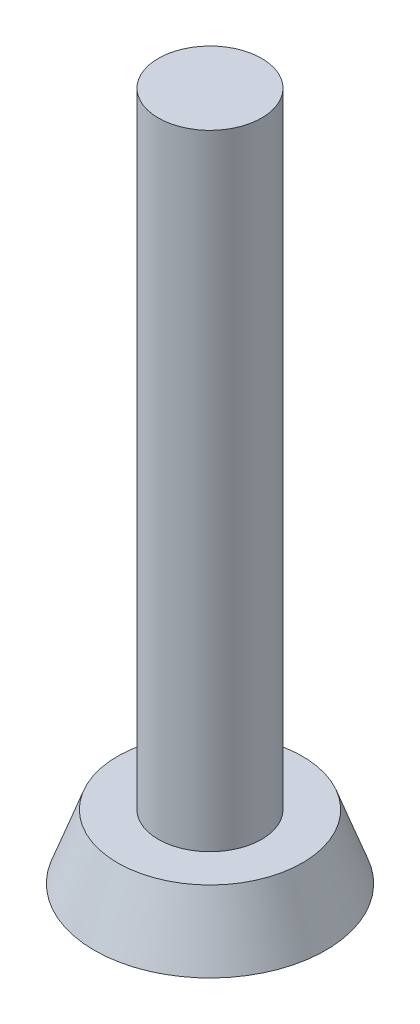
ISO-10303-21;
HEADER;
FILE_DESCRIPTION(('STEP AP214'),'2;1');
FILE_NAME('part.step','',(''),(''),'','','');
FILE_SCHEMA(('AUTOMOTIVE_DESIGN { 1 0 10303 214 1 1 1 1 }'));
ENDSEC;
DATA;
#1=APPLICATION_CONTEXT('core data for automotive mechanical design processes');
#2=APPLICATION_PROTOCOL_DEFINITION('international standard','automotive_design',2000,#1);
#3=PRODUCT_CONTEXT('',#1,'mechanical');
#4=PRODUCT('Part','Part','',(#3));
#5=PRODUCT_RELATED_PRODUCT_CATEGORY('part','',(#4));
#6=PRODUCT_DEFINITION_FORMATION('','',#4);
#7=PRODUCT_DEFINITION_CONTEXT('part definition',#1,'design');
#8=PRODUCT_DEFINITION('design','',#6,#7);
#9=PRODUCT_DEFINITION_SHAPE('','',#8);
#10=(LENGTH_UNIT() NAMED_UNIT(*) SI_UNIT(.MILLI.,.METRE.));
#11=(NAMED_UNIT(*) PLANE_ANGLE_UNIT() SI_UNIT($,.RADIAN.));
#12=(NAMED_UNIT(*) SI_UNIT($,.STERADIAN.) SOLID_ANGLE_UNIT());
#13=UNCERTAINTY_MEASURE_WITH_UNIT(LENGTH_MEASURE(1.E-05),#10,'distance_accuracy_value','');
#14=(GEOMETRIC_REPRESENTATION_CONTEXT(3) GLOBAL_UNCERTAINTY_ASSIGNED_CONTEXT((#13)) GLOBAL_UNIT_ASSIGNED_CONTEXT((#10,
#11,#12)) REPRESENTATION_CONTEXT('',''));
#15=CARTESIAN_POINT('',(0.,0.,0.));
#16=DIRECTION('',(0.,0.,1.));
#17=DIRECTION('',(1.,0.,0.));
#18=AXIS2_PLACEMENT_3D('',#15,#16,#17);
#19=CARTESIAN_POINT('',(0.,0.,0.));
#20=DIRECTION('',(0.,-1.,0.));
#21=DIRECTION('',(0.,0.,1.));
#22=AXIS2_PLACEMENT_3D('',#19,#20,#21);
#23=CONICAL_SURFACE('',#22,3.36,0.349065850398866);
#24=CARTESIAN_POINT('',(0.,1.86,0.));
#25=DIRECTION('',(0.,1.,0.));
#26=DIRECTION('',(0.,0.,1.));
#27=AXIS2_PLACEMENT_3D('',#24,#25,#26);
#28=CIRCLE('',#27,2.68301536426486);
#29=CARTESIAN_POINT('',(0.,1.86,2.68301536426486));
#30=VERTEX_POINT('',#29);
#31=EDGE_CURVE('E11',#30,#30,#28,.T.);
#32=ORIENTED_EDGE('',*,*,#31,.F.);
#33=EDGE_LOOP('',(#32));
#34=FACE_BOUND('',#33,.T.);
#35=CARTESIAN_POINT('',(0.,0.,0.));
#36=DIRECTION('',(0.,1.,0.));
#37=DIRECTION('',(0.,0.,1.));
#38=AXIS2_PLACEMENT_3D('',#35,#36,#37);
#39=CIRCLE('',#38,3.36);
#40=CARTESIAN_POINT('',(0.,0.,3.36));
#41=VERTEX_POINT('',#40);
#42=EDGE_CURVE('E39',#41,#41,#39,.T.);
#43=ORIENTED_EDGE('',*,*,#42,.T.);
#44=EDGE_LOOP('',(#43));
#45=FACE_BOUND('',#44,.T.);
#46=ADVANCED_FACE('F32',(#34,#45),#23,.T.);
#47=CARTESIAN_POINT('',(0.,1.86,0.));
#48=DIRECTION('',(0.,1.,0.));
#49=DIRECTION('',(0.,0.,1.));
#50=AXIS2_PLACEMENT_3D('',#47,#48,#49);
#51=PLANE('',#50);
#52=CARTESIAN_POINT('',(0.,1.86,0.));
#53=DIRECTION('',(0.,1.,0.));
#54=DIRECTION('',(0.,0.,1.));
#55=AXIS2_PLACEMENT_3D('',#52,#53,#54);
#56=CIRCLE('',#55,1.5);
#57=CARTESIAN_POINT('',(0.,1.86,1.5));
#58=VERTEX_POINT('',#57);
#59=EDGE_CURVE('E133',#58,#58,#56,.T.);
#60=ORIENTED_EDGE('',*,*,#59,.F.);
#61=EDGE_LOOP('',(#60));
#62=FACE_BOUND('',#61,.T.);
#63=ORIENTED_EDGE('',*,*,#31,.T.);
#64=EDGE_LOOP('',(#63));
#65=FACE_BOUND('',#64,.T.);
#66=ADVANCED_FACE('F150',(#62,#65),#51,.T.);
#67=CARTESIAN_POINT('',(0.,0.,0.));
#68=DIRECTION('',(0.,1.,0.));
#69=DIRECTION('',(0.,0.,1.));
#70=AXIS2_PLACEMENT_3D('',#67,#68,#69);
#71=PLANE('',#70);
#72=DIRECTION('',(-0.866025403784439,0.,-0.5));
#73=VECTOR('',#72,1.);
#74=CARTESIAN_POINT('',(0.,0.,1.15470053837925));
#75=LINE('',#74,#73);
#76=CARTESIAN_POINT('',(0.,0.,1.15470053837925));
#77=VERTEX_POINT('',#76);
#78=CARTESIAN_POINT('',(-1.,0.,0.577350269189626));
#79=VERTEX_POINT('',#78);
#80=EDGE_CURVE('E120',#77,#79,#75,.T.);
#81=ORIENTED_EDGE('',*,*,#80,.F.);
#82=DIRECTION('',(-0.866025403784439,0.,0.5));
#83=VECTOR('',#82,1.);
#84=CARTESIAN_POINT('',(1.,0.,0.577350269189626));
#85=LINE('',#84,#83);
#86=CARTESIAN_POINT('',(1.,0.,0.577350269189626));
#87=VERTEX_POINT('',#86);
#88=EDGE_CURVE('E46',#87,#77,#85,.T.);
#89=ORIENTED_EDGE('',*,*,#88,.F.);
#90=DIRECTION('',(0.,0.,1.));
#91=VECTOR('',#90,1.);
#92=CARTESIAN_POINT('',(1.,0.,-0.577350269189626));
#93=LINE('',#92,#91);
#94=CARTESIAN_POINT('',(1.,0.,-0.577350269189626));
#95=VERTEX_POINT('',#94);
#96=EDGE_CURVE('E129',#95,#87,#93,.T.);
#97=ORIENTED_EDGE('',*,*,#96,.F.);
#98=DIRECTION('',(0.866025403784439,0.,0.5));
#99=VECTOR('',#98,1.);
#100=CARTESIAN_POINT('',(0.,0.,-1.15470053837925));
#101=LINE('',#100,#99);
#102=CARTESIAN_POINT('',(0.,0.,-1.15470053837925));
#103=VERTEX_POINT('',#102);
#104=EDGE_CURVE('E127',#103,#95,#101,.T.);
#105=ORIENTED_EDGE('',*,*,#104,.F.);
#106=DIRECTION('',(0.866025403784439,0.,-0.5));
#107=VECTOR('',#106,1.);
#108=CARTESIAN_POINT('',(-1.,0.,-0.577350269189626));
#109=LINE('',#108,#107);
#110=CARTESIAN_POINT('',(-1.,0.,-0.577350269189626));
#111=VERTEX_POINT('',#110);
#112=EDGE_CURVE('E94',#111,#103,#109,.T.);
#113=ORIENTED_EDGE('',*,*,#112,.F.);
#114=DIRECTION('',(0.,0.,-1.));
#115=VECTOR('',#114,1.);
#116=CARTESIAN_POINT('',(-1.,0.,0.577350269189626));
#117=LINE('',#116,#115);
#118=EDGE_CURVE('E123',#79,#111,#117,.T.);
#119=ORIENTED_EDGE('',*,*,#118,.F.);
#120=EDGE_LOOP('',(#81,#89,#97,#105,#113,#119));
#121=FACE_BOUND('',#120,.T.);
#122=ORIENTED_EDGE('',*,*,#42,.F.);
#123=EDGE_LOOP('',(#122));
#124=FACE_BOUND('',#123,.T.);
#125=ADVANCED_FACE('F147',(#121,#124),#71,.F.);
#126=CARTESIAN_POINT('',(0.,20.,0.));
#127=DIRECTION('',(0.,-1.,0.));
#128=DIRECTION('',(0.,0.,-1.));
#129=AXIS2_PLACEMENT_3D('',#126,#127,#128);
#130=CYLINDRICAL_SURFACE('',#129,1.5);
#131=CARTESIAN_POINT('',(0.,20.,0.));
#132=DIRECTION('',(0.,1.,0.));
#133=DIRECTION('',(0.,0.,1.));
#134=AXIS2_PLACEMENT_3D('',#131,#132,#133);
#135=CIRCLE('',#134,1.5);
#136=CARTESIAN_POINT('',(0.,20.,1.5));
#137=VERTEX_POINT('',#136);
#138=EDGE_CURVE('E139',#137,#137,#135,.T.);
#139=ORIENTED_EDGE('',*,*,#138,.F.);
#140=EDGE_LOOP('',(#139));
#141=FACE_BOUND('',#140,.T.);
#142=ORIENTED_EDGE('',*,*,#59,.T.);
#143=EDGE_LOOP('',(#142));
#144=FACE_BOUND('',#143,.T.);
#145=ADVANCED_FACE('F149',(#141,#144),#130,.T.);
#146=CARTESIAN_POINT('',(0.,20.,0.));
#147=DIRECTION('',(0.,1.,0.));
#148=DIRECTION('',(0.,0.,1.));
#149=AXIS2_PLACEMENT_3D('',#146,#147,#148);
#150=PLANE('',#149);
#151=ORIENTED_EDGE('',*,*,#138,.T.);
#152=EDGE_LOOP('',(#151));
#153=FACE_BOUND('',#152,.T.);
#154=ADVANCED_FACE('F156',(#153),#150,.T.);
#155=CARTESIAN_POINT('',(1.,1.5,0.577350269189626));
#156=DIRECTION('',(0.5,0.,0.866025403784439));
#157=DIRECTION('',(0.866025403784439,0.,-0.5));
#158=AXIS2_PLACEMENT_3D('',#155,#156,#157);
#159=PLANE('',#158);
#160=ORIENTED_EDGE('',*,*,#88,.T.);
#161=DIRECTION('',(0.,-1.,0.));
#162=VECTOR('',#161,1.);
#163=CARTESIAN_POINT('',(0.,1.5,1.15470053837925));
#164=LINE('',#163,#162);
#165=CARTESIAN_POINT('',(0.,1.5,1.15470053837925));
#166=VERTEX_POINT('',#165);
#167=EDGE_CURVE('E76',#166,#77,#164,.T.);
#168=ORIENTED_EDGE('',*,*,#167,.F.);
#169=DIRECTION('',(-0.866025403784439,0.,0.5));
#170=VECTOR('',#169,1.);
#171=CARTESIAN_POINT('',(1.,1.5,0.577350269189626));
#172=LINE('',#171,#170);
#173=CARTESIAN_POINT('',(1.,1.5,0.577350269189626));
#174=VERTEX_POINT('',#173);
#175=EDGE_CURVE('E131',#174,#166,#172,.T.);
#176=ORIENTED_EDGE('',*,*,#175,.F.);
#177=DIRECTION('',(0.,-1.,0.));
#178=VECTOR('',#177,1.);
#179=CARTESIAN_POINT('',(1.,1.5,0.577350269189626));
#180=LINE('',#179,#178);
#181=EDGE_CURVE('E54',#174,#87,#180,.T.);
#182=ORIENTED_EDGE('',*,*,#181,.T.);
#183=EDGE_LOOP('',(#160,#168,#176,#182));
#184=FACE_BOUND('',#183,.T.);
#185=ADVANCED_FACE('F187',(#184),#159,.F.);
#186=CARTESIAN_POINT('',(1.,1.5,-0.577350269189626));
#187=DIRECTION('',(1.,0.,0.));
#188=DIRECTION('',(0.,0.,-1.));
#189=AXIS2_PLACEMENT_3D('',#186,#187,#188);
#190=PLANE('',#189);
#191=ORIENTED_EDGE('',*,*,#96,.T.);
#192=ORIENTED_EDGE('',*,*,#181,.F.);
#193=DIRECTION('',(0.,0.,1.));
#194=VECTOR('',#193,1.);
#195=CARTESIAN_POINT('',(1.,1.5,-0.577350269189626));
#196=LINE('',#195,#194);
#197=CARTESIAN_POINT('',(1.,1.5,-0.577350269189626));
#198=VERTEX_POINT('',#197);
#199=EDGE_CURVE('E106',#198,#174,#196,.T.);
#200=ORIENTED_EDGE('',*,*,#199,.F.);
#201=DIRECTION('',(0.,-1.,0.));
#202=VECTOR('',#201,1.);
#203=CARTESIAN_POINT('',(1.,1.5,-0.577350269189626));
#204=LINE('',#203,#202);
#205=EDGE_CURVE('E98',#198,#95,#204,.T.);
#206=ORIENTED_EDGE('',*,*,#205,.T.);
#207=EDGE_LOOP('',(#191,#192,#200,#206));
#208=FACE_BOUND('',#207,.T.);
#209=ADVANCED_FACE('F201',(#208),#190,.F.);
#210=CARTESIAN_POINT('',(0.,1.5,-1.15470053837925));
#211=DIRECTION('',(0.5,0.,-0.866025403784439));
#212=DIRECTION('',(-0.866025403784439,0.,-0.5));
#213=AXIS2_PLACEMENT_3D('',#210,#211,#212);
#214=PLANE('',#213);
#215=ORIENTED_EDGE('',*,*,#104,.T.);
#216=ORIENTED_EDGE('',*,*,#205,.F.);
#217=DIRECTION('',(0.866025403784439,0.,0.5));
#218=VECTOR('',#217,1.);
#219=CARTESIAN_POINT('',(0.,1.5,-1.15470053837925));
#220=LINE('',#219,#218);
#221=CARTESIAN_POINT('',(0.,1.5,-1.15470053837925));
#222=VERTEX_POINT('',#221);
#223=EDGE_CURVE('E102',#222,#198,#220,.T.);
#224=ORIENTED_EDGE('',*,*,#223,.F.);
#225=DIRECTION('',(0.,-1.,0.));
#226=VECTOR('',#225,1.);
#227=CARTESIAN_POINT('',(0.,1.5,-1.15470053837925));
#228=LINE('',#227,#226);
#229=EDGE_CURVE('E87',#222,#103,#228,.T.);
#230=ORIENTED_EDGE('',*,*,#229,.T.);
#231=EDGE_LOOP('',(#215,#216,#224,#230));
#232=FACE_BOUND('',#231,.T.);
#233=ADVANCED_FACE('F103',(#232),#214,.F.);
#234=CARTESIAN_POINT('',(-1.,1.5,-0.577350269189626));
#235=DIRECTION('',(-0.5,0.,-0.866025403784438));
#236=DIRECTION('',(-0.866025403784439,0.,0.5));
#237=AXIS2_PLACEMENT_3D('',#234,#235,#236);
#238=PLANE('',#237);
#239=ORIENTED_EDGE('',*,*,#112,.T.);
#240=ORIENTED_EDGE('',*,*,#229,.F.);
#241=DIRECTION('',(0.866025403784439,0.,-0.5));
#242=VECTOR('',#241,1.);
#243=CARTESIAN_POINT('',(-1.,1.5,-0.577350269189626));
#244=LINE('',#243,#242);
#245=CARTESIAN_POINT('',(-1.,1.5,-0.577350269189626));
#246=VERTEX_POINT('',#245);
#247=EDGE_CURVE('E91',#246,#222,#244,.T.);
#248=ORIENTED_EDGE('',*,*,#247,.F.);
#249=DIRECTION('',(0.,-1.,0.));
#250=VECTOR('',#249,1.);
#251=CARTESIAN_POINT('',(-1.,1.5,-0.577350269189626));
#252=LINE('',#251,#250);
#253=EDGE_CURVE('E99',#246,#111,#252,.T.);
#254=ORIENTED_EDGE('',*,*,#253,.T.);
#255=EDGE_LOOP('',(#239,#240,#248,#254));
#256=FACE_BOUND('',#255,.T.);
#257=ADVANCED_FACE('F89',(#256),#238,.F.);
#258=CARTESIAN_POINT('',(-1.,1.5,0.577350269189626));
#259=DIRECTION('',(-1.,0.,0.));
#260=DIRECTION('',(0.,0.,1.));
#261=AXIS2_PLACEMENT_3D('',#258,#259,#260);
#262=PLANE('',#261);
#263=ORIENTED_EDGE('',*,*,#118,.T.);
#264=ORIENTED_EDGE('',*,*,#253,.F.);
#265=DIRECTION('',(0.,0.,-1.));
#266=VECTOR('',#265,1.);
#267=CARTESIAN_POINT('',(-1.,1.5,0.577350269189626));
#268=LINE('',#267,#266);
#269=CARTESIAN_POINT('',(-1.,1.5,0.577350269189626));
#270=VERTEX_POINT('',#269);
#271=EDGE_CURVE('E112',#270,#246,#268,.T.);
#272=ORIENTED_EDGE('',*,*,#271,.F.);
#273=DIRECTION('',(0.,-1.,0.));
#274=VECTOR('',#273,1.);
#275=CARTESIAN_POINT('',(-1.,1.5,0.577350269189626));
#276=LINE('',#275,#274);
#277=EDGE_CURVE('E136',#270,#79,#276,.T.);
#278=ORIENTED_EDGE('',*,*,#277,.T.);
#279=EDGE_LOOP('',(#263,#264,#272,#278));
#280=FACE_BOUND('',#279,.T.);
#281=ADVANCED_FACE('F226',(#280),#262,.F.);
#282=CARTESIAN_POINT('',(0.,1.5,1.15470053837925));
#283=DIRECTION('',(-0.5,0.,0.866025403784439));
#284=DIRECTION('',(0.866025403784439,0.,0.5));
#285=AXIS2_PLACEMENT_3D('',#282,#283,#284);
#286=PLANE('',#285);
#287=ORIENTED_EDGE('',*,*,#80,.T.);
#288=ORIENTED_EDGE('',*,*,#277,.F.);
#289=DIRECTION('',(-0.866025403784439,0.,-0.5));
#290=VECTOR('',#289,1.);
#291=CARTESIAN_POINT('',(0.,1.5,1.15470053837925));
#292=LINE('',#291,#290);
#293=EDGE_CURVE('E114',#166,#270,#292,.T.);
#294=ORIENTED_EDGE('',*,*,#293,.F.);
#295=ORIENTED_EDGE('',*,*,#167,.T.);
#296=EDGE_LOOP('',(#287,#288,#294,#295));
#297=FACE_BOUND('',#296,.T.);
#298=ADVANCED_FACE('F235',(#297),#286,.F.);
#299=CARTESIAN_POINT('',(0.,1.5,0.));
#300=DIRECTION('',(0.,-1.,0.));
#301=DIRECTION('',(0.,0.,-1.));
#302=AXIS2_PLACEMENT_3D('',#299,#300,#301);
#303=PLANE('',#302);
#304=ORIENTED_EDGE('',*,*,#175,.T.);
#305=ORIENTED_EDGE('',*,*,#293,.T.);
#306=ORIENTED_EDGE('',*,*,#271,.T.);
#307=ORIENTED_EDGE('',*,*,#247,.T.);
#308=ORIENTED_EDGE('',*,*,#223,.T.);
#309=ORIENTED_EDGE('',*,*,#199,.T.);
#310=EDGE_LOOP('',(#304,#305,#306,#307,#308,#309));
#311=FACE_BOUND('',#310,.T.);
#312=ADVANCED_FACE('F109',(#311),#303,.T.);
#313=CLOSED_SHELL('',(#46,#66,#125,#145,#154,#185,#209,#233,#257,#281,#298,#312));
#314=MANIFOLD_SOLID_BREP('B2',#313);
#315=ADVANCED_BREP_SHAPE_REPRESENTATION('',(#18,#314),#14);
#316=SHAPE_DEFINITION_REPRESENTATION(#9,#315);
ENDSEC;
END-ISO-10303-21;
